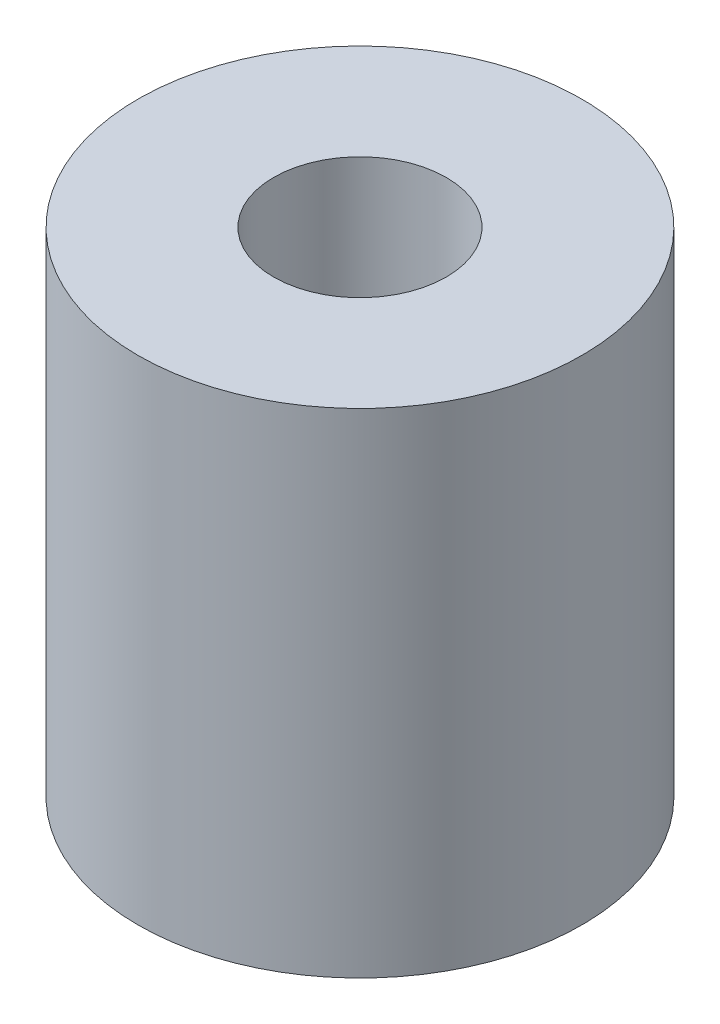
ISO-10303-21;
HEADER;
FILE_DESCRIPTION(('STEP AP214'),'2;1');
FILE_NAME('part.step','',(''),(''),'','','');
FILE_SCHEMA(('AUTOMOTIVE_DESIGN { 1 0 10303 214 1 1 1 1 }'));
ENDSEC;
DATA;
#1=APPLICATION_CONTEXT('core data for automotive mechanical design processes');
#2=APPLICATION_PROTOCOL_DEFINITION('international standard','automotive_design',2000,#1);
#3=PRODUCT_CONTEXT('',#1,'mechanical');
#4=PRODUCT('Part','Part','',(#3));
#5=PRODUCT_RELATED_PRODUCT_CATEGORY('part','',(#4));
#6=PRODUCT_DEFINITION_FORMATION('','',#4);
#7=PRODUCT_DEFINITION_CONTEXT('part definition',#1,'design');
#8=PRODUCT_DEFINITION('design','',#6,#7);
#9=PRODUCT_DEFINITION_SHAPE('','',#8);
#10=(LENGTH_UNIT() NAMED_UNIT(*) SI_UNIT(.MILLI.,.METRE.));
#11=(NAMED_UNIT(*) PLANE_ANGLE_UNIT() SI_UNIT($,.RADIAN.));
#12=(NAMED_UNIT(*) SI_UNIT($,.STERADIAN.) SOLID_ANGLE_UNIT());
#13=UNCERTAINTY_MEASURE_WITH_UNIT(LENGTH_MEASURE(1.E-05),#10,'distance_accuracy_value','');
#14=(GEOMETRIC_REPRESENTATION_CONTEXT(3) GLOBAL_UNCERTAINTY_ASSIGNED_CONTEXT((#13)) GLOBAL_UNIT_ASSIGNED_CONTEXT((#10,
#11,#12)) REPRESENTATION_CONTEXT('',''));
#15=CARTESIAN_POINT('',(0.,0.,0.));
#16=DIRECTION('',(0.,0.,1.));
#17=DIRECTION('',(1.,0.,0.));
#18=AXIS2_PLACEMENT_3D('',#15,#16,#17);
#19=CARTESIAN_POINT('',(0.,10.,0.));
#20=DIRECTION('',(0.,1.,0.));
#21=DIRECTION('',(0.,0.,1.));
#22=AXIS2_PLACEMENT_3D('',#19,#20,#21);
#23=PLANE('',#22);
#24=CARTESIAN_POINT('',(0.,10.,0.));
#25=DIRECTION('',(0.,1.,0.));
#26=DIRECTION('',(0.,0.,1.));
#27=AXIS2_PLACEMENT_3D('',#24,#25,#26);
#28=CIRCLE('',#27,4.5);
#29=CARTESIAN_POINT('',(0.,10.,4.5));
#30=VERTEX_POINT('',#29);
#31=EDGE_CURVE('E11',#30,#30,#28,.T.);
#32=ORIENTED_EDGE('',*,*,#31,.T.);
#33=EDGE_LOOP('',(#32));
#34=FACE_BOUND('',#33,.T.);
#35=CARTESIAN_POINT('',(0.,10.,0.));
#36=DIRECTION('',(0.,1.,0.));
#37=DIRECTION('',(0.,0.,1.));
#38=AXIS2_PLACEMENT_3D('',#35,#36,#37);
#39=CIRCLE('',#38,1.75);
#40=CARTESIAN_POINT('',(0.,10.,1.75));
#41=VERTEX_POINT('',#40);
#42=EDGE_CURVE('E54',#41,#41,#39,.T.);
#43=ORIENTED_EDGE('',*,*,#42,.F.);
#44=EDGE_LOOP('',(#43));
#45=FACE_BOUND('',#44,.T.);
#46=ADVANCED_FACE('F43',(#34,#45),#23,.T.);
#47=CARTESIAN_POINT('',(0.,0.,0.));
#48=DIRECTION('',(0.,1.,0.));
#49=DIRECTION('',(0.,0.,1.));
#50=AXIS2_PLACEMENT_3D('',#47,#48,#49);
#51=PLANE('',#50);
#52=CARTESIAN_POINT('',(0.,0.,0.));
#53=DIRECTION('',(0.,1.,0.));
#54=DIRECTION('',(0.,0.,1.));
#55=AXIS2_PLACEMENT_3D('',#52,#53,#54);
#56=CIRCLE('',#55,4.5);
#57=CARTESIAN_POINT('',(0.,0.,4.5));
#58=VERTEX_POINT('',#57);
#59=EDGE_CURVE('E47',#58,#58,#56,.T.);
#60=ORIENTED_EDGE('',*,*,#59,.F.);
#61=EDGE_LOOP('',(#60));
#62=FACE_BOUND('',#61,.T.);
#63=CARTESIAN_POINT('',(0.,0.,0.));
#64=DIRECTION('',(0.,1.,0.));
#65=DIRECTION('',(0.,0.,1.));
#66=AXIS2_PLACEMENT_3D('',#63,#64,#65);
#67=CIRCLE('',#66,1.75);
#68=CARTESIAN_POINT('',(0.,0.,1.75));
#69=VERTEX_POINT('',#68);
#70=EDGE_CURVE('E56',#69,#69,#67,.T.);
#71=ORIENTED_EDGE('',*,*,#70,.T.);
#72=EDGE_LOOP('',(#71));
#73=FACE_BOUND('',#72,.T.);
#74=ADVANCED_FACE('F66',(#62,#73),#51,.F.);
#75=CARTESIAN_POINT('',(0.,10.,0.));
#76=DIRECTION('',(0.,-1.,0.));
#77=DIRECTION('',(0.,0.,-1.));
#78=AXIS2_PLACEMENT_3D('',#75,#76,#77);
#79=CYLINDRICAL_SURFACE('',#78,4.5);
#80=ORIENTED_EDGE('',*,*,#31,.F.);
#81=EDGE_LOOP('',(#80));
#82=FACE_BOUND('',#81,.T.);
#83=ORIENTED_EDGE('',*,*,#59,.T.);
#84=EDGE_LOOP('',(#83));
#85=FACE_BOUND('',#84,.T.);
#86=ADVANCED_FACE('F45',(#82,#85),#79,.T.);
#87=CARTESIAN_POINT('',(0.,10.,0.));
#88=DIRECTION('',(0.,-1.,0.));
#89=DIRECTION('',(0.,0.,-1.));
#90=AXIS2_PLACEMENT_3D('',#87,#88,#89);
#91=CYLINDRICAL_SURFACE('',#90,1.75);
#92=ORIENTED_EDGE('',*,*,#42,.T.);
#93=EDGE_LOOP('',(#92));
#94=FACE_BOUND('',#93,.T.);
#95=ORIENTED_EDGE('',*,*,#70,.F.);
#96=EDGE_LOOP('',(#95));
#97=FACE_BOUND('',#96,.T.);
#98=ADVANCED_FACE('F62',(#94,#97),#91,.F.);
#99=CLOSED_SHELL('',(#46,#74,#86,#98));
#100=MANIFOLD_SOLID_BREP('B2',#99);
#101=ADVANCED_BREP_SHAPE_REPRESENTATION('',(#18,#100),#14);
#102=SHAPE_DEFINITION_REPRESENTATION(#9,#101);
ENDSEC;
END-ISO-10303-21;
